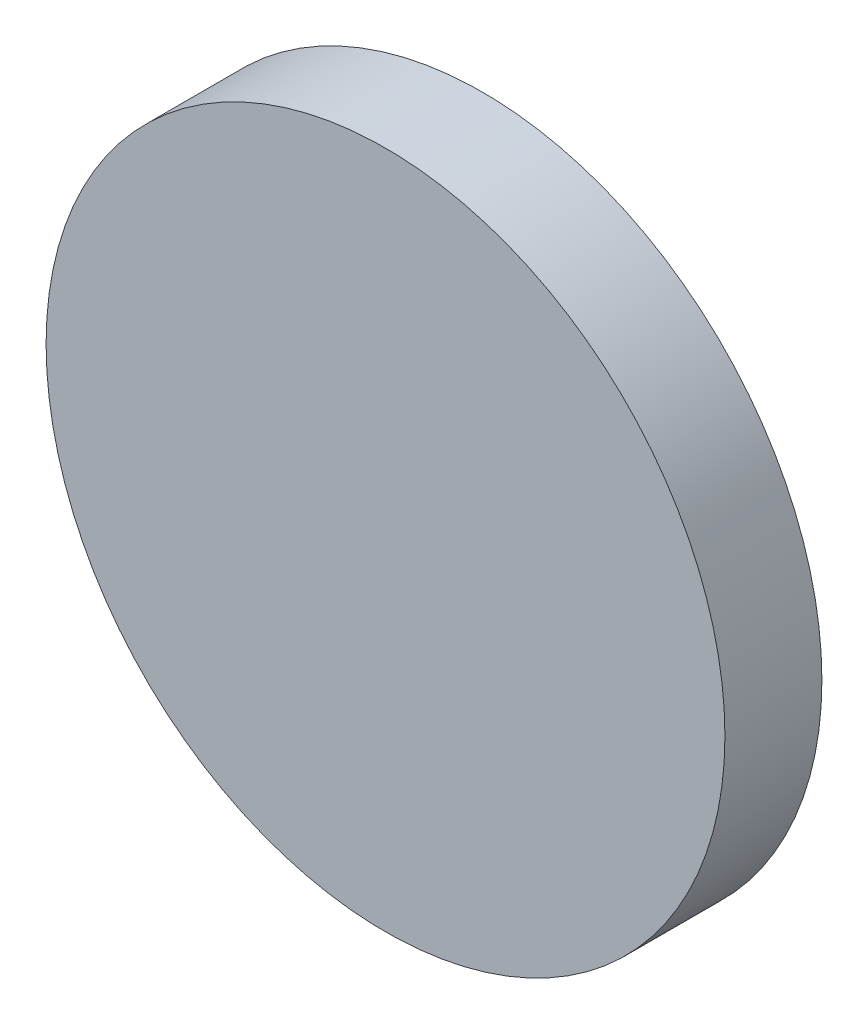
ISO-10303-21;
HEADER;
FILE_DESCRIPTION(('STEP AP214'),'2;1');
FILE_NAME('part.step','',(''),(''),'','','');
FILE_SCHEMA(('AUTOMOTIVE_DESIGN { 1 0 10303 214 1 1 1 1 }'));
ENDSEC;
DATA;
#1=APPLICATION_CONTEXT('core data for automotive mechanical design processes');
#2=APPLICATION_PROTOCOL_DEFINITION('international standard','automotive_design',2000,#1);
#3=PRODUCT_CONTEXT('',#1,'mechanical');
#4=PRODUCT('Part','Part','',(#3));
#5=PRODUCT_RELATED_PRODUCT_CATEGORY('part','',(#4));
#6=PRODUCT_DEFINITION_FORMATION('','',#4);
#7=PRODUCT_DEFINITION_CONTEXT('part definition',#1,'design');
#8=PRODUCT_DEFINITION('design','',#6,#7);
#9=PRODUCT_DEFINITION_SHAPE('','',#8);
#10=(LENGTH_UNIT() NAMED_UNIT(*) SI_UNIT(.MILLI.,.METRE.));
#11=(NAMED_UNIT(*) PLANE_ANGLE_UNIT() SI_UNIT($,.RADIAN.));
#12=(NAMED_UNIT(*) SI_UNIT($,.STERADIAN.) SOLID_ANGLE_UNIT());
#13=UNCERTAINTY_MEASURE_WITH_UNIT(LENGTH_MEASURE(1.E-05),#10,'distance_accuracy_value','');
#14=(GEOMETRIC_REPRESENTATION_CONTEXT(3) GLOBAL_UNCERTAINTY_ASSIGNED_CONTEXT((#13)) GLOBAL_UNIT_ASSIGNED_CONTEXT((#10,
#11,#12)) REPRESENTATION_CONTEXT('',''));
#15=CARTESIAN_POINT('',(0.,0.,0.));
#16=DIRECTION('',(0.,0.,1.));
#17=DIRECTION('',(1.,0.,0.));
#18=AXIS2_PLACEMENT_3D('',#15,#16,#17);
#19=CARTESIAN_POINT('',(0.,0.,20.));
#20=DIRECTION('',(0.,0.,-1.));
#21=DIRECTION('',(-1.,0.,0.));
#22=AXIS2_PLACEMENT_3D('',#19,#20,#21);
#23=CYLINDRICAL_SURFACE('',#22,70.);
#24=CARTESIAN_POINT('',(0.,0.,20.));
#25=DIRECTION('',(0.,0.,1.));
#26=DIRECTION('',(1.,0.,0.));
#27=AXIS2_PLACEMENT_3D('',#24,#25,#26);
#28=CIRCLE('',#27,70.);
#29=CARTESIAN_POINT('',(70.,0.,20.));
#30=VERTEX_POINT('',#29);
#31=EDGE_CURVE('E10',#30,#30,#28,.T.);
#32=ORIENTED_EDGE('',*,*,#31,.F.);
#33=EDGE_LOOP('',(#32));
#34=FACE_BOUND('',#33,.T.);
#35=CARTESIAN_POINT('',(0.,0.,0.));
#36=DIRECTION('',(0.,0.,1.));
#37=DIRECTION('',(1.,0.,0.));
#38=AXIS2_PLACEMENT_3D('',#35,#36,#37);
#39=CIRCLE('',#38,70.);
#40=CARTESIAN_POINT('',(70.,0.,0.));
#41=VERTEX_POINT('',#40);
#42=EDGE_CURVE('E40',#41,#41,#39,.T.);
#43=ORIENTED_EDGE('',*,*,#42,.T.);
#44=EDGE_LOOP('',(#43));
#45=FACE_BOUND('',#44,.T.);
#46=ADVANCED_FACE('F37',(#34,#45),#23,.T.);
#47=CARTESIAN_POINT('',(0.,0.,20.));
#48=DIRECTION('',(0.,0.,1.));
#49=DIRECTION('',(1.,0.,0.));
#50=AXIS2_PLACEMENT_3D('',#47,#48,#49);
#51=PLANE('',#50);
#52=ORIENTED_EDGE('',*,*,#31,.T.);
#53=EDGE_LOOP('',(#52));
#54=FACE_BOUND('',#53,.T.);
#55=ADVANCED_FACE('F52',(#54),#51,.T.);
#56=CARTESIAN_POINT('',(0.,0.,0.));
#57=DIRECTION('',(0.,0.,1.));
#58=DIRECTION('',(1.,0.,0.));
#59=AXIS2_PLACEMENT_3D('',#56,#57,#58);
#60=PLANE('',#59);
#61=ORIENTED_EDGE('',*,*,#42,.F.);
#62=EDGE_LOOP('',(#61));
#63=FACE_BOUND('',#62,.T.);
#64=ADVANCED_FACE('F50',(#63),#60,.F.);
#65=CLOSED_SHELL('',(#46,#55,#64));
#66=MANIFOLD_SOLID_BREP('B2',#65);
#67=ADVANCED_BREP_SHAPE_REPRESENTATION('',(#18,#66),#14);
#68=SHAPE_DEFINITION_REPRESENTATION(#9,#67);
ENDSEC;
END-ISO-10303-21;
